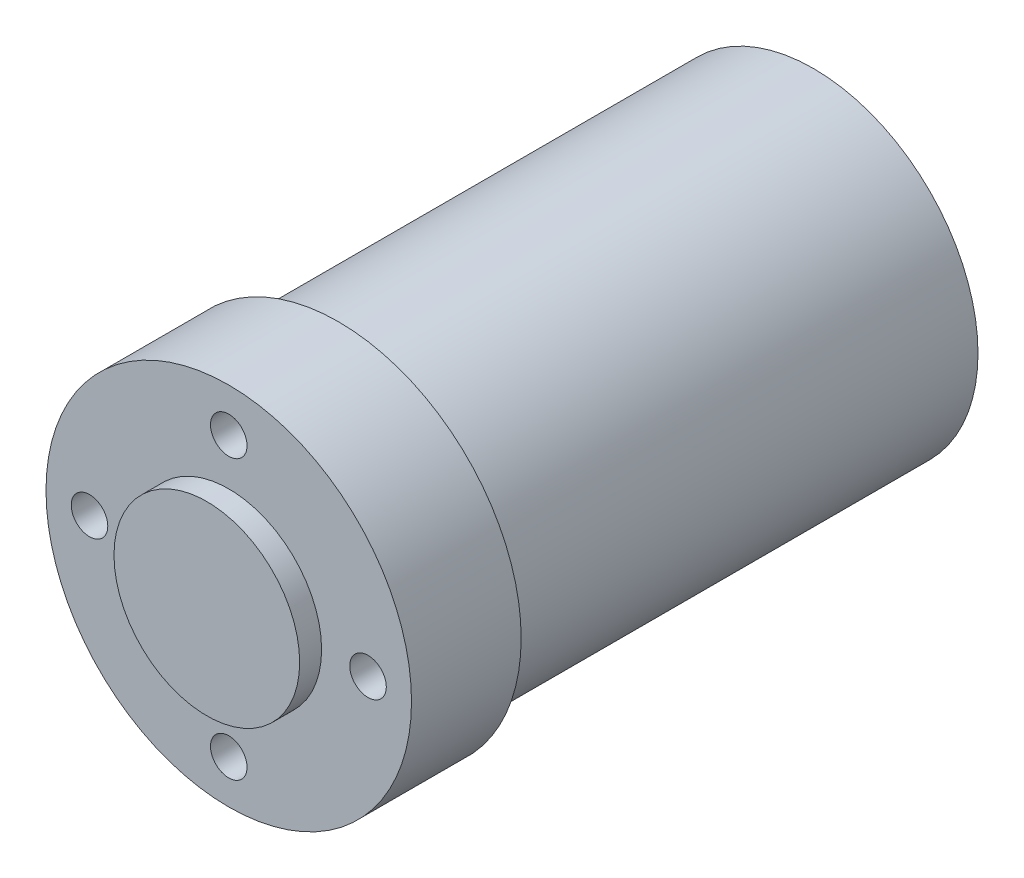
ISO-10303-21;
HEADER;
FILE_DESCRIPTION(('STEP AP214'),'2;1');
FILE_NAME('part.step','',(''),(''),'','','');
FILE_SCHEMA(('AUTOMOTIVE_DESIGN { 1 0 10303 214 1 1 1 1 }'));
ENDSEC;
DATA;
#1=APPLICATION_CONTEXT('core data for automotive mechanical design processes');
#2=APPLICATION_PROTOCOL_DEFINITION('international standard','automotive_design',2000,#1);
#3=PRODUCT_CONTEXT('',#1,'mechanical');
#4=PRODUCT('Part','Part','',(#3));
#5=PRODUCT_RELATED_PRODUCT_CATEGORY('part','',(#4));
#6=PRODUCT_DEFINITION_FORMATION('','',#4);
#7=PRODUCT_DEFINITION_CONTEXT('part definition',#1,'design');
#8=PRODUCT_DEFINITION('design','',#6,#7);
#9=PRODUCT_DEFINITION_SHAPE('','',#8);
#10=(LENGTH_UNIT() NAMED_UNIT(*) SI_UNIT(.MILLI.,.METRE.));
#11=(NAMED_UNIT(*) PLANE_ANGLE_UNIT() SI_UNIT($,.RADIAN.));
#12=(NAMED_UNIT(*) SI_UNIT($,.STERADIAN.) SOLID_ANGLE_UNIT());
#13=UNCERTAINTY_MEASURE_WITH_UNIT(LENGTH_MEASURE(1.E-05),#10,'distance_accuracy_value','');
#14=(GEOMETRIC_REPRESENTATION_CONTEXT(3) GLOBAL_UNCERTAINTY_ASSIGNED_CONTEXT((#13)) GLOBAL_UNIT_ASSIGNED_CONTEXT((#10,
#11,#12)) REPRESENTATION_CONTEXT('',''));
#15=CARTESIAN_POINT('',(0.,0.,0.));
#16=DIRECTION('',(0.,0.,1.));
#17=DIRECTION('',(1.,0.,0.));
#18=AXIS2_PLACEMENT_3D('',#15,#16,#17);
#19=CARTESIAN_POINT('',(0.,0.,80.));
#20=DIRECTION('',(0.,0.,-1.));
#21=DIRECTION('',(-1.,0.,0.));
#22=AXIS2_PLACEMENT_3D('',#19,#20,#21);
#23=CYLINDRICAL_SURFACE('',#22,25.);
#24=CARTESIAN_POINT('',(0.,0.,80.));
#25=DIRECTION('',(0.,0.,-1.));
#26=DIRECTION('',(-1.,0.,0.));
#27=AXIS2_PLACEMENT_3D('',#24,#25,#26);
#28=CIRCLE('',#27,25.);
#29=CARTESIAN_POINT('',(-25.,0.,80.));
#30=VERTEX_POINT('',#29);
#31=EDGE_CURVE('E10',#30,#30,#28,.T.);
#32=ORIENTED_EDGE('',*,*,#31,.T.);
#33=EDGE_LOOP('',(#32));
#34=FACE_BOUND('',#33,.T.);
#35=CARTESIAN_POINT('',(0.,0.,65.));
#36=DIRECTION('',(0.,0.,-1.));
#37=DIRECTION('',(-1.,0.,0.));
#38=AXIS2_PLACEMENT_3D('',#35,#36,#37);
#39=CIRCLE('',#38,25.);
#40=CARTESIAN_POINT('',(-25.,0.,65.));
#41=VERTEX_POINT('',#40);
#42=EDGE_CURVE('E40',#41,#41,#39,.T.);
#43=ORIENTED_EDGE('',*,*,#42,.F.);
#44=EDGE_LOOP('',(#43));
#45=FACE_BOUND('',#44,.T.);
#46=ADVANCED_FACE('F34',(#34,#45),#23,.T.);
#47=CARTESIAN_POINT('',(25.,0.,80.));
#48=DIRECTION('',(0.,0.,1.));
#49=DIRECTION('',(1.,0.,0.));
#50=AXIS2_PLACEMENT_3D('',#47,#48,#49);
#51=PLANE('',#50);
#52=CARTESIAN_POINT('',(-19.0499999999995,-5.41433564649196E-13,80.));
#53=DIRECTION('',(0.,0.,1.));
#54=DIRECTION('',(1.,0.,0.));
#55=AXIS2_PLACEMENT_3D('',#52,#53,#54);
#56=CIRCLE('',#55,2.50000000000086);
#57=CARTESIAN_POINT('',(-16.5499999999986,-5.41433564649196E-13,80.));
#58=VERTEX_POINT('',#57);
#59=EDGE_CURVE('E128',#58,#58,#56,.T.);
#60=ORIENTED_EDGE('',*,*,#59,.F.);
#61=EDGE_LOOP('',(#60));
#62=FACE_BOUND('',#61,.T.);
#63=CARTESIAN_POINT('',(1.07820122499364E-12,-19.05,80.));
#64=DIRECTION('',(0.,0.,1.));
#65=DIRECTION('',(1.,0.,0.));
#66=AXIS2_PLACEMENT_3D('',#63,#64,#65);
#67=CIRCLE('',#66,2.50000000000086);
#68=CARTESIAN_POINT('',(2.50000000000193,-19.05,80.));
#69=VERTEX_POINT('',#68);
#70=EDGE_CURVE('E122',#69,#69,#67,.T.);
#71=ORIENTED_EDGE('',*,*,#70,.F.);
#72=EDGE_LOOP('',(#71));
#73=FACE_BOUND('',#72,.T.);
#74=CARTESIAN_POINT('',(19.0500000000005,5.39100612496821E-13,80.));
#75=DIRECTION('',(0.,0.,1.));
#76=DIRECTION('',(1.,0.,0.));
#77=AXIS2_PLACEMENT_3D('',#74,#75,#76);
#78=CIRCLE('',#77,2.50000000000086);
#79=CARTESIAN_POINT('',(21.5500000000014,5.39100612496821E-13,80.));
#80=VERTEX_POINT('',#79);
#81=EDGE_CURVE('E116',#80,#80,#78,.T.);
#82=ORIENTED_EDGE('',*,*,#81,.F.);
#83=EDGE_LOOP('',(#82));
#84=FACE_BOUND('',#83,.T.);
#85=CARTESIAN_POINT('',(0.,19.05,80.));
#86=DIRECTION('',(0.,0.,1.));
#87=DIRECTION('',(1.,0.,0.));
#88=AXIS2_PLACEMENT_3D('',#85,#86,#87);
#89=CIRCLE('',#88,2.50000000000086);
#90=CARTESIAN_POINT('',(2.50000000000086,19.05,80.));
#91=VERTEX_POINT('',#90);
#92=EDGE_CURVE('E110',#91,#91,#89,.T.);
#93=ORIENTED_EDGE('',*,*,#92,.F.);
#94=EDGE_LOOP('',(#93));
#95=FACE_BOUND('',#94,.T.);
#96=CARTESIAN_POINT('',(0.,0.,80.));
#97=DIRECTION('',(0.,0.,1.));
#98=DIRECTION('',(1.,0.,0.));
#99=AXIS2_PLACEMENT_3D('',#96,#97,#98);
#100=CIRCLE('',#99,12.7);
#101=CARTESIAN_POINT('',(12.7,0.,80.));
#102=VERTEX_POINT('',#101);
#103=EDGE_CURVE('E48',#102,#102,#100,.T.);
#104=ORIENTED_EDGE('',*,*,#103,.F.);
#105=EDGE_LOOP('',(#104));
#106=FACE_BOUND('',#105,.T.);
#107=ORIENTED_EDGE('',*,*,#31,.F.);
#108=EDGE_LOOP('',(#107));
#109=FACE_BOUND('',#108,.T.);
#110=ADVANCED_FACE('F134',(#62,#73,#84,#95,#106,#109),#51,.T.);
#111=CARTESIAN_POINT('',(0.,0.,65.));
#112=DIRECTION('',(0.,0.,-1.));
#113=DIRECTION('',(-1.,0.,0.));
#114=AXIS2_PLACEMENT_3D('',#111,#112,#113);
#115=PLANE('',#114);
#116=CARTESIAN_POINT('',(0.,0.,65.));
#117=DIRECTION('',(0.,0.,-1.));
#118=DIRECTION('',(-1.,0.,0.));
#119=AXIS2_PLACEMENT_3D('',#116,#117,#118);
#120=CIRCLE('',#119,22.4917);
#121=CARTESIAN_POINT('',(-22.4917,0.,65.));
#122=VERTEX_POINT('',#121);
#123=EDGE_CURVE('E54',#122,#122,#120,.T.);
#124=ORIENTED_EDGE('',*,*,#123,.F.);
#125=EDGE_LOOP('',(#124));
#126=FACE_BOUND('',#125,.T.);
#127=ORIENTED_EDGE('',*,*,#42,.T.);
#128=EDGE_LOOP('',(#127));
#129=FACE_BOUND('',#128,.T.);
#130=ADVANCED_FACE('F137',(#126,#129),#115,.T.);
#131=CARTESIAN_POINT('',(0.,0.,83.));
#132=DIRECTION('',(0.,0.,-1.));
#133=DIRECTION('',(-1.,0.,0.));
#134=AXIS2_PLACEMENT_3D('',#131,#132,#133);
#135=CYLINDRICAL_SURFACE('',#134,12.7);
#136=CARTESIAN_POINT('',(0.,0.,83.));
#137=DIRECTION('',(0.,0.,1.));
#138=DIRECTION('',(1.,0.,0.));
#139=AXIS2_PLACEMENT_3D('',#136,#137,#138);
#140=CIRCLE('',#139,12.7);
#141=CARTESIAN_POINT('',(12.7,0.,83.));
#142=VERTEX_POINT('',#141);
#143=EDGE_CURVE('E44',#142,#142,#140,.T.);
#144=ORIENTED_EDGE('',*,*,#143,.F.);
#145=EDGE_LOOP('',(#144));
#146=FACE_BOUND('',#145,.T.);
#147=ORIENTED_EDGE('',*,*,#103,.T.);
#148=EDGE_LOOP('',(#147));
#149=FACE_BOUND('',#148,.T.);
#150=ADVANCED_FACE('F147',(#146,#149),#135,.T.);
#151=CARTESIAN_POINT('',(0.,0.,83.));
#152=DIRECTION('',(0.,0.,1.));
#153=DIRECTION('',(1.,0.,0.));
#154=AXIS2_PLACEMENT_3D('',#151,#152,#153);
#155=PLANE('',#154);
#156=ORIENTED_EDGE('',*,*,#143,.T.);
#157=EDGE_LOOP('',(#156));
#158=FACE_BOUND('',#157,.T.);
#159=ADVANCED_FACE('F149',(#158),#155,.T.);
#160=CARTESIAN_POINT('',(0.,0.,0.));
#161=DIRECTION('',(0.,0.,1.));
#162=DIRECTION('',(1.,0.,0.));
#163=AXIS2_PLACEMENT_3D('',#160,#161,#162);
#164=CYLINDRICAL_SURFACE('',#163,22.4917);
#165=CARTESIAN_POINT('',(0.,0.,0.));
#166=DIRECTION('',(0.,0.,-1.));
#167=DIRECTION('',(-1.,0.,0.));
#168=AXIS2_PLACEMENT_3D('',#165,#166,#167);
#169=CIRCLE('',#168,22.4917);
#170=CARTESIAN_POINT('',(-22.4917,0.,0.));
#171=VERTEX_POINT('',#170);
#172=EDGE_CURVE('E52',#171,#171,#169,.T.);
#173=ORIENTED_EDGE('',*,*,#172,.F.);
#174=EDGE_LOOP('',(#173));
#175=FACE_BOUND('',#174,.T.);
#176=ORIENTED_EDGE('',*,*,#123,.T.);
#177=EDGE_LOOP('',(#176));
#178=FACE_BOUND('',#177,.T.);
#179=ADVANCED_FACE('F156',(#175,#178),#164,.T.);
#180=CARTESIAN_POINT('',(0.,0.,0.));
#181=DIRECTION('',(0.,0.,-1.));
#182=DIRECTION('',(-1.,0.,0.));
#183=AXIS2_PLACEMENT_3D('',#180,#181,#182);
#184=PLANE('',#183);
#185=CARTESIAN_POINT('',(12.3743686707641,12.3743686707635,0.));
#186=DIRECTION('',(0.,0.,-1.));
#187=DIRECTION('',(-1.,0.,0.));
#188=AXIS2_PLACEMENT_3D('',#185,#186,#187);
#189=CIRCLE('',#188,2.49999999999999);
#190=CARTESIAN_POINT('',(9.87436867076416,12.3743686707635,0.));
#191=VERTEX_POINT('',#190);
#192=EDGE_CURVE('E104',#191,#191,#189,.T.);
#193=ORIENTED_EDGE('',*,*,#192,.F.);
#194=EDGE_LOOP('',(#193));
#195=FACE_BOUND('',#194,.T.);
#196=CARTESIAN_POINT('',(17.4999999999985,-1.49213974509621E-12,0.));
#197=DIRECTION('',(0.,0.,-1.));
#198=DIRECTION('',(-1.,0.,0.));
#199=AXIS2_PLACEMENT_3D('',#196,#197,#198);
#200=CIRCLE('',#199,2.49999999999999);
#201=CARTESIAN_POINT('',(14.9999999999985,-1.49213974509621E-12,0.));
#202=VERTEX_POINT('',#201);
#203=EDGE_CURVE('E98',#202,#202,#200,.T.);
#204=ORIENTED_EDGE('',*,*,#203,.F.);
#205=EDGE_LOOP('',(#204));
#206=FACE_BOUND('',#205,.T.);
#207=CARTESIAN_POINT('',(12.374368670762,-12.3743686707656,0.));
#208=DIRECTION('',(0.,0.,-1.));
#209=DIRECTION('',(-1.,0.,0.));
#210=AXIS2_PLACEMENT_3D('',#207,#208,#209);
#211=CIRCLE('',#210,2.49999999999999);
#212=CARTESIAN_POINT('',(9.87436867076205,-12.3743686707656,0.));
#213=VERTEX_POINT('',#212);
#214=EDGE_CURVE('E92',#213,#213,#211,.T.);
#215=ORIENTED_EDGE('',*,*,#214,.F.);
#216=EDGE_LOOP('',(#215));
#217=FACE_BOUND('',#216,.T.);
#218=CARTESIAN_POINT('',(-2.97999322639541E-12,-17.5,0.));
#219=DIRECTION('',(0.,0.,-1.));
#220=DIRECTION('',(-1.,0.,0.));
#221=AXIS2_PLACEMENT_3D('',#218,#219,#220);
#222=CIRCLE('',#221,2.49999999999999);
#223=CARTESIAN_POINT('',(-2.50000000000297,-17.5,0.));
#224=VERTEX_POINT('',#223);
#225=EDGE_CURVE('E86',#224,#224,#222,.T.);
#226=ORIENTED_EDGE('',*,*,#225,.F.);
#227=EDGE_LOOP('',(#226));
#228=FACE_BOUND('',#227,.T.);
#229=CARTESIAN_POINT('',(-12.3743686707671,-12.3743686707635,0.));
#230=DIRECTION('',(0.,0.,-1.));
#231=DIRECTION('',(-1.,0.,0.));
#232=AXIS2_PLACEMENT_3D('',#229,#230,#231);
#233=CIRCLE('',#232,2.49999999999999);
#234=CARTESIAN_POINT('',(-14.8743686707671,-12.3743686707635,0.));
#235=VERTEX_POINT('',#234);
#236=EDGE_CURVE('E80',#235,#235,#233,.T.);
#237=ORIENTED_EDGE('',*,*,#236,.F.);
#238=EDGE_LOOP('',(#237));
#239=FACE_BOUND('',#238,.T.);
#240=CARTESIAN_POINT('',(-17.5000000000015,1.4899966131977E-12,0.));
#241=DIRECTION('',(0.,0.,-1.));
#242=DIRECTION('',(-1.,0.,0.));
#243=AXIS2_PLACEMENT_3D('',#240,#241,#242);
#244=CIRCLE('',#243,2.49999999999999);
#245=CARTESIAN_POINT('',(-20.0000000000015,1.4899966131977E-12,0.));
#246=VERTEX_POINT('',#245);
#247=EDGE_CURVE('E74',#246,#246,#244,.T.);
#248=ORIENTED_EDGE('',*,*,#247,.F.);
#249=EDGE_LOOP('',(#248));
#250=FACE_BOUND('',#249,.T.);
#251=CARTESIAN_POINT('',(-12.374368670765,12.3743686707656,0.));
#252=DIRECTION('',(0.,0.,-1.));
#253=DIRECTION('',(-1.,0.,0.));
#254=AXIS2_PLACEMENT_3D('',#251,#252,#253);
#255=CIRCLE('',#254,2.49999999999999);
#256=CARTESIAN_POINT('',(-14.874368670765,12.3743686707656,0.));
#257=VERTEX_POINT('',#256);
#258=EDGE_CURVE('E68',#257,#257,#255,.T.);
#259=ORIENTED_EDGE('',*,*,#258,.F.);
#260=EDGE_LOOP('',(#259));
#261=FACE_BOUND('',#260,.T.);
#262=CARTESIAN_POINT('',(0.,17.5,0.));
#263=DIRECTION('',(0.,0.,-1.));
#264=DIRECTION('',(-1.,0.,0.));
#265=AXIS2_PLACEMENT_3D('',#262,#263,#264);
#266=CIRCLE('',#265,2.49999999999999);
#267=CARTESIAN_POINT('',(-2.49999999999999,17.5,0.));
#268=VERTEX_POINT('',#267);
#269=EDGE_CURVE('E62',#268,#268,#266,.T.);
#270=ORIENTED_EDGE('',*,*,#269,.F.);
#271=EDGE_LOOP('',(#270));
#272=FACE_BOUND('',#271,.T.);
#273=ORIENTED_EDGE('',*,*,#172,.T.);
#274=EDGE_LOOP('',(#273));
#275=FACE_BOUND('',#274,.T.);
#276=ADVANCED_FACE('F189',(#195,#206,#217,#228,#239,#250,#261,#272,#275),#184,.T.);
#277=CARTESIAN_POINT('',(0.,17.5,7.99999999999999));
#278=DIRECTION('',(0.,0.,1.));
#279=DIRECTION('',(1.,0.,0.));
#280=AXIS2_PLACEMENT_3D('',#277,#278,#279);
#281=PLANE('',#280);
#282=CARTESIAN_POINT('',(0.,17.5,7.99999999999999));
#283=DIRECTION('',(0.,0.,-1.));
#284=DIRECTION('',(-1.,0.,0.));
#285=AXIS2_PLACEMENT_3D('',#282,#283,#284);
#286=CIRCLE('',#285,2.49999999999999);
#287=CARTESIAN_POINT('',(-2.49999999999999,17.5,7.99999999999999));
#288=VERTEX_POINT('',#287);
#289=EDGE_CURVE('E57',#288,#288,#286,.T.);
#290=ORIENTED_EDGE('',*,*,#289,.T.);
#291=EDGE_LOOP('',(#290));
#292=FACE_BOUND('',#291,.T.);
#293=ADVANCED_FACE('F199',(#292),#281,.F.);
#294=CARTESIAN_POINT('',(0.,17.5,0.));
#295=DIRECTION('',(0.,0.,-1.));
#296=DIRECTION('',(-1.,0.,0.));
#297=AXIS2_PLACEMENT_3D('',#294,#295,#296);
#298=CYLINDRICAL_SURFACE('',#297,2.49999999999999);
#299=ORIENTED_EDGE('',*,*,#289,.F.);
#300=EDGE_LOOP('',(#299));
#301=FACE_BOUND('',#300,.T.);
#302=ORIENTED_EDGE('',*,*,#269,.T.);
#303=EDGE_LOOP('',(#302));
#304=FACE_BOUND('',#303,.T.);
#305=ADVANCED_FACE('F209',(#301,#304),#298,.F.);
#306=CARTESIAN_POINT('',(-12.374368670765,12.3743686707656,7.99999999999999));
#307=DIRECTION('',(0.,0.,1.));
#308=DIRECTION('',(1.,0.,0.));
#309=AXIS2_PLACEMENT_3D('',#306,#307,#308);
#310=PLANE('',#309);
#311=CARTESIAN_POINT('',(-12.374368670765,12.3743686707656,7.99999999999999));
#312=DIRECTION('',(0.,0.,-1.));
#313=DIRECTION('',(-1.,0.,0.));
#314=AXIS2_PLACEMENT_3D('',#311,#312,#313);
#315=CIRCLE('',#314,2.49999999999999);
#316=CARTESIAN_POINT('',(-14.874368670765,12.3743686707656,7.99999999999999));
#317=VERTEX_POINT('',#316);
#318=EDGE_CURVE('E65',#317,#317,#315,.T.);
#319=ORIENTED_EDGE('',*,*,#318,.T.);
#320=EDGE_LOOP('',(#319));
#321=FACE_BOUND('',#320,.T.);
#322=ADVANCED_FACE('F219',(#321),#310,.F.);
#323=CARTESIAN_POINT('',(-12.374368670765,12.3743686707656,0.));
#324=DIRECTION('',(0.,0.,-1.));
#325=DIRECTION('',(-1.,0.,0.));
#326=AXIS2_PLACEMENT_3D('',#323,#324,#325);
#327=CYLINDRICAL_SURFACE('',#326,2.49999999999999);
#328=ORIENTED_EDGE('',*,*,#318,.F.);
#329=EDGE_LOOP('',(#328));
#330=FACE_BOUND('',#329,.T.);
#331=ORIENTED_EDGE('',*,*,#258,.T.);
#332=EDGE_LOOP('',(#331));
#333=FACE_BOUND('',#332,.T.);
#334=ADVANCED_FACE('F229',(#330,#333),#327,.F.);
#335=CARTESIAN_POINT('',(-17.5000000000015,1.4899966131977E-12,7.99999999999999));
#336=DIRECTION('',(0.,0.,1.));
#337=DIRECTION('',(1.,0.,0.));
#338=AXIS2_PLACEMENT_3D('',#335,#336,#337);
#339=PLANE('',#338);
#340=CARTESIAN_POINT('',(-17.5000000000015,1.4899966131977E-12,7.99999999999999));
#341=DIRECTION('',(0.,0.,-1.));
#342=DIRECTION('',(-1.,0.,0.));
#343=AXIS2_PLACEMENT_3D('',#340,#341,#342);
#344=CIRCLE('',#343,2.49999999999999);
#345=CARTESIAN_POINT('',(-20.0000000000015,1.4899966131977E-12,7.99999999999999));
#346=VERTEX_POINT('',#345);
#347=EDGE_CURVE('E71',#346,#346,#344,.T.);
#348=ORIENTED_EDGE('',*,*,#347,.T.);
#349=EDGE_LOOP('',(#348));
#350=FACE_BOUND('',#349,.T.);
#351=ADVANCED_FACE('F239',(#350),#339,.F.);
#352=CARTESIAN_POINT('',(-17.5000000000015,1.4899966131977E-12,0.));
#353=DIRECTION('',(0.,0.,-1.));
#354=DIRECTION('',(-1.,0.,0.));
#355=AXIS2_PLACEMENT_3D('',#352,#353,#354);
#356=CYLINDRICAL_SURFACE('',#355,2.49999999999999);
#357=ORIENTED_EDGE('',*,*,#347,.F.);
#358=EDGE_LOOP('',(#357));
#359=FACE_BOUND('',#358,.T.);
#360=ORIENTED_EDGE('',*,*,#247,.T.);
#361=EDGE_LOOP('',(#360));
#362=FACE_BOUND('',#361,.T.);
#363=ADVANCED_FACE('F249',(#359,#362),#356,.F.);
#364=CARTESIAN_POINT('',(-12.3743686707671,-12.3743686707635,7.99999999999999));
#365=DIRECTION('',(0.,0.,1.));
#366=DIRECTION('',(1.,0.,0.));
#367=AXIS2_PLACEMENT_3D('',#364,#365,#366);
#368=PLANE('',#367);
#369=CARTESIAN_POINT('',(-12.3743686707671,-12.3743686707635,7.99999999999999));
#370=DIRECTION('',(0.,0.,-1.));
#371=DIRECTION('',(-1.,0.,0.));
#372=AXIS2_PLACEMENT_3D('',#369,#370,#371);
#373=CIRCLE('',#372,2.49999999999999);
#374=CARTESIAN_POINT('',(-14.8743686707671,-12.3743686707635,7.99999999999999));
#375=VERTEX_POINT('',#374);
#376=EDGE_CURVE('E77',#375,#375,#373,.T.);
#377=ORIENTED_EDGE('',*,*,#376,.T.);
#378=EDGE_LOOP('',(#377));
#379=FACE_BOUND('',#378,.T.);
#380=ADVANCED_FACE('F259',(#379),#368,.F.);
#381=CARTESIAN_POINT('',(-12.3743686707671,-12.3743686707635,0.));
#382=DIRECTION('',(0.,0.,-1.));
#383=DIRECTION('',(-1.,0.,0.));
#384=AXIS2_PLACEMENT_3D('',#381,#382,#383);
#385=CYLINDRICAL_SURFACE('',#384,2.49999999999999);
#386=ORIENTED_EDGE('',*,*,#376,.F.);
#387=EDGE_LOOP('',(#386));
#388=FACE_BOUND('',#387,.T.);
#389=ORIENTED_EDGE('',*,*,#236,.T.);
#390=EDGE_LOOP('',(#389));
#391=FACE_BOUND('',#390,.T.);
#392=ADVANCED_FACE('F269',(#388,#391),#385,.F.);
#393=CARTESIAN_POINT('',(-2.98195266127404E-12,-17.5,7.99999999999999));
#394=DIRECTION('',(0.,0.,1.));
#395=DIRECTION('',(1.,0.,0.));
#396=AXIS2_PLACEMENT_3D('',#393,#394,#395);
#397=PLANE('',#396);
#398=CARTESIAN_POINT('',(-2.97999322639541E-12,-17.5,7.99999999999999));
#399=DIRECTION('',(0.,0.,-1.));
#400=DIRECTION('',(-1.,0.,0.));
#401=AXIS2_PLACEMENT_3D('',#398,#399,#400);
#402=CIRCLE('',#401,2.49999999999999);
#403=CARTESIAN_POINT('',(-2.50000000000297,-17.5,7.99999999999999));
#404=VERTEX_POINT('',#403);
#405=EDGE_CURVE('E83',#404,#404,#402,.T.);
#406=ORIENTED_EDGE('',*,*,#405,.T.);
#407=EDGE_LOOP('',(#406));
#408=FACE_BOUND('',#407,.T.);
#409=ADVANCED_FACE('F279',(#408),#397,.F.);
#410=CARTESIAN_POINT('',(-2.97999322639541E-12,-17.5,0.));
#411=DIRECTION('',(0.,0.,-1.));
#412=DIRECTION('',(-1.,0.,0.));
#413=AXIS2_PLACEMENT_3D('',#410,#411,#412);
#414=CYLINDRICAL_SURFACE('',#413,2.49999999999999);
#415=ORIENTED_EDGE('',*,*,#405,.F.);
#416=EDGE_LOOP('',(#415));
#417=FACE_BOUND('',#416,.T.);
#418=ORIENTED_EDGE('',*,*,#225,.T.);
#419=EDGE_LOOP('',(#418));
#420=FACE_BOUND('',#419,.T.);
#421=ADVANCED_FACE('F289',(#417,#420),#414,.F.);
#422=CARTESIAN_POINT('',(12.374368670762,-12.3743686707656,7.99999999999999));
#423=DIRECTION('',(0.,0.,1.));
#424=DIRECTION('',(1.,0.,0.));
#425=AXIS2_PLACEMENT_3D('',#422,#423,#424);
#426=PLANE('',#425);
#427=CARTESIAN_POINT('',(12.374368670762,-12.3743686707656,7.99999999999999));
#428=DIRECTION('',(0.,0.,-1.));
#429=DIRECTION('',(-1.,0.,0.));
#430=AXIS2_PLACEMENT_3D('',#427,#428,#429);
#431=CIRCLE('',#430,2.49999999999999);
#432=CARTESIAN_POINT('',(9.87436867076205,-12.3743686707656,7.99999999999999));
#433=VERTEX_POINT('',#432);
#434=EDGE_CURVE('E89',#433,#433,#431,.T.);
#435=ORIENTED_EDGE('',*,*,#434,.T.);
#436=EDGE_LOOP('',(#435));
#437=FACE_BOUND('',#436,.T.);
#438=ADVANCED_FACE('F299',(#437),#426,.F.);
#439=CARTESIAN_POINT('',(12.374368670762,-12.3743686707656,0.));
#440=DIRECTION('',(0.,0.,-1.));
#441=DIRECTION('',(-1.,0.,0.));
#442=AXIS2_PLACEMENT_3D('',#439,#440,#441);
#443=CYLINDRICAL_SURFACE('',#442,2.49999999999999);
#444=ORIENTED_EDGE('',*,*,#434,.F.);
#445=EDGE_LOOP('',(#444));
#446=FACE_BOUND('',#445,.T.);
#447=ORIENTED_EDGE('',*,*,#214,.T.);
#448=EDGE_LOOP('',(#447));
#449=FACE_BOUND('',#448,.T.);
#450=ADVANCED_FACE('F309',(#446,#449),#443,.F.);
#451=CARTESIAN_POINT('',(17.4999999999985,-1.49213974509621E-12,7.99999999999999));
#452=DIRECTION('',(0.,0.,1.));
#453=DIRECTION('',(1.,0.,0.));
#454=AXIS2_PLACEMENT_3D('',#451,#452,#453);
#455=PLANE('',#454);
#456=CARTESIAN_POINT('',(17.4999999999985,-1.49213974509621E-12,7.99999999999999));
#457=DIRECTION('',(0.,0.,-1.));
#458=DIRECTION('',(-1.,0.,0.));
#459=AXIS2_PLACEMENT_3D('',#456,#457,#458);
#460=CIRCLE('',#459,2.49999999999999);
#461=CARTESIAN_POINT('',(14.9999999999985,-1.49213974509621E-12,7.99999999999999));
#462=VERTEX_POINT('',#461);
#463=EDGE_CURVE('E95',#462,#462,#460,.T.);
#464=ORIENTED_EDGE('',*,*,#463,.T.);
#465=EDGE_LOOP('',(#464));
#466=FACE_BOUND('',#465,.T.);
#467=ADVANCED_FACE('F319',(#466),#455,.F.);
#468=CARTESIAN_POINT('',(17.4999999999985,-1.49213974509621E-12,0.));
#469=DIRECTION('',(0.,0.,-1.));
#470=DIRECTION('',(-1.,0.,0.));
#471=AXIS2_PLACEMENT_3D('',#468,#469,#470);
#472=CYLINDRICAL_SURFACE('',#471,2.49999999999999);
#473=ORIENTED_EDGE('',*,*,#463,.F.);
#474=EDGE_LOOP('',(#473));
#475=FACE_BOUND('',#474,.T.);
#476=ORIENTED_EDGE('',*,*,#203,.T.);
#477=EDGE_LOOP('',(#476));
#478=FACE_BOUND('',#477,.T.);
#479=ADVANCED_FACE('F329',(#475,#478),#472,.F.);
#480=CARTESIAN_POINT('',(12.3743686707641,12.3743686707635,7.99999999999999));
#481=DIRECTION('',(0.,0.,1.));
#482=DIRECTION('',(1.,0.,0.));
#483=AXIS2_PLACEMENT_3D('',#480,#481,#482);
#484=PLANE('',#483);
#485=CARTESIAN_POINT('',(12.3743686707641,12.3743686707635,7.99999999999999));
#486=DIRECTION('',(0.,0.,-1.));
#487=DIRECTION('',(-1.,0.,0.));
#488=AXIS2_PLACEMENT_3D('',#485,#486,#487);
#489=CIRCLE('',#488,2.49999999999999);
#490=CARTESIAN_POINT('',(9.87436867076416,12.3743686707635,7.99999999999999));
#491=VERTEX_POINT('',#490);
#492=EDGE_CURVE('E101',#491,#491,#489,.T.);
#493=ORIENTED_EDGE('',*,*,#492,.T.);
#494=EDGE_LOOP('',(#493));
#495=FACE_BOUND('',#494,.T.);
#496=ADVANCED_FACE('F339',(#495),#484,.F.);
#497=CARTESIAN_POINT('',(12.3743686707641,12.3743686707635,0.));
#498=DIRECTION('',(0.,0.,-1.));
#499=DIRECTION('',(-1.,0.,0.));
#500=AXIS2_PLACEMENT_3D('',#497,#498,#499);
#501=CYLINDRICAL_SURFACE('',#500,2.49999999999999);
#502=ORIENTED_EDGE('',*,*,#492,.F.);
#503=EDGE_LOOP('',(#502));
#504=FACE_BOUND('',#503,.T.);
#505=ORIENTED_EDGE('',*,*,#192,.T.);
#506=EDGE_LOOP('',(#505));
#507=FACE_BOUND('',#506,.T.);
#508=ADVANCED_FACE('F348',(#504,#507),#501,.F.);
#509=CARTESIAN_POINT('',(0.,19.05,67.554));
#510=DIRECTION('',(0.,0.,-1.));
#511=DIRECTION('',(-1.,0.,0.));
#512=AXIS2_PLACEMENT_3D('',#509,#510,#511);
#513=PLANE('',#512);
#514=CARTESIAN_POINT('',(0.,19.05,67.554));
#515=DIRECTION('',(0.,0.,1.));
#516=DIRECTION('',(1.,0.,0.));
#517=AXIS2_PLACEMENT_3D('',#514,#515,#516);
#518=CIRCLE('',#517,2.50000000000085);
#519=CARTESIAN_POINT('',(2.50000000000085,19.05,67.554));
#520=VERTEX_POINT('',#519);
#521=EDGE_CURVE('E107',#520,#520,#518,.T.);
#522=ORIENTED_EDGE('',*,*,#521,.T.);
#523=EDGE_LOOP('',(#522));
#524=FACE_BOUND('',#523,.T.);
#525=ADVANCED_FACE('F357',(#524),#513,.F.);
#526=CARTESIAN_POINT('',(0.,19.05,80.));
#527=DIRECTION('',(0.,0.,1.));
#528=DIRECTION('',(1.,0.,0.));
#529=AXIS2_PLACEMENT_3D('',#526,#527,#528);
#530=CYLINDRICAL_SURFACE('',#529,2.50000000000085);
#531=ORIENTED_EDGE('',*,*,#521,.F.);
#532=EDGE_LOOP('',(#531));
#533=FACE_BOUND('',#532,.T.);
#534=ORIENTED_EDGE('',*,*,#92,.T.);
#535=EDGE_LOOP('',(#534));
#536=FACE_BOUND('',#535,.T.);
#537=ADVANCED_FACE('F367',(#533,#536),#530,.F.);
#538=CARTESIAN_POINT('',(19.0500000000005,5.39100612496821E-13,67.554));
#539=DIRECTION('',(0.,0.,-1.));
#540=DIRECTION('',(-1.,0.,0.));
#541=AXIS2_PLACEMENT_3D('',#538,#539,#540);
#542=PLANE('',#541);
#543=CARTESIAN_POINT('',(19.0500000000005,5.39100612496821E-13,67.554));
#544=DIRECTION('',(0.,0.,1.));
#545=DIRECTION('',(1.,0.,0.));
#546=AXIS2_PLACEMENT_3D('',#543,#544,#545);
#547=CIRCLE('',#546,2.50000000000086);
#548=CARTESIAN_POINT('',(21.5500000000014,5.39100612496821E-13,67.554));
#549=VERTEX_POINT('',#548);
#550=EDGE_CURVE('E113',#549,#549,#547,.T.);
#551=ORIENTED_EDGE('',*,*,#550,.T.);
#552=EDGE_LOOP('',(#551));
#553=FACE_BOUND('',#552,.T.);
#554=ADVANCED_FACE('F374',(#553),#542,.F.);
#555=CARTESIAN_POINT('',(19.0500000000005,5.39100612496821E-13,80.));
#556=DIRECTION('',(0.,0.,1.));
#557=DIRECTION('',(1.,0.,0.));
#558=AXIS2_PLACEMENT_3D('',#555,#556,#557);
#559=CYLINDRICAL_SURFACE('',#558,2.50000000000086);
#560=ORIENTED_EDGE('',*,*,#550,.F.);
#561=EDGE_LOOP('',(#560));
#562=FACE_BOUND('',#561,.T.);
#563=ORIENTED_EDGE('',*,*,#81,.T.);
#564=EDGE_LOOP('',(#563));
#565=FACE_BOUND('',#564,.T.);
#566=ADVANCED_FACE('F382',(#562,#565),#559,.F.);
#567=CARTESIAN_POINT('',(1.0751528341812E-12,-19.05,67.554));
#568=DIRECTION('',(0.,0.,-1.));
#569=DIRECTION('',(-1.,0.,0.));
#570=AXIS2_PLACEMENT_3D('',#567,#568,#569);
#571=PLANE('',#570);
#572=CARTESIAN_POINT('',(1.07820122499364E-12,-19.05,67.554));
#573=DIRECTION('',(0.,0.,1.));
#574=DIRECTION('',(1.,0.,0.));
#575=AXIS2_PLACEMENT_3D('',#572,#573,#574);
#576=CIRCLE('',#575,2.50000000000085);
#577=CARTESIAN_POINT('',(2.50000000000193,-19.05,67.554));
#578=VERTEX_POINT('',#577);
#579=EDGE_CURVE('E119',#578,#578,#576,.T.);
#580=ORIENTED_EDGE('',*,*,#579,.T.);
#581=EDGE_LOOP('',(#580));
#582=FACE_BOUND('',#581,.T.);
#583=ADVANCED_FACE('F390',(#582),#571,.F.);
#584=CARTESIAN_POINT('',(1.07820122499364E-12,-19.05,80.));
#585=DIRECTION('',(0.,0.,1.));
#586=DIRECTION('',(1.,0.,0.));
#587=AXIS2_PLACEMENT_3D('',#584,#585,#586);
#588=CYLINDRICAL_SURFACE('',#587,2.50000000000085);
#589=ORIENTED_EDGE('',*,*,#579,.F.);
#590=EDGE_LOOP('',(#589));
#591=FACE_BOUND('',#590,.T.);
#592=ORIENTED_EDGE('',*,*,#70,.T.);
#593=EDGE_LOOP('',(#592));
#594=FACE_BOUND('',#593,.T.);
#595=ADVANCED_FACE('F398',(#591,#594),#588,.F.);
#596=CARTESIAN_POINT('',(-19.0499999999995,-5.41433564649196E-13,67.554));
#597=DIRECTION('',(0.,0.,-1.));
#598=DIRECTION('',(-1.,0.,0.));
#599=AXIS2_PLACEMENT_3D('',#596,#597,#598);
#600=PLANE('',#599);
#601=CARTESIAN_POINT('',(-19.0499999999995,-5.41433564649196E-13,67.554));
#602=DIRECTION('',(0.,0.,1.));
#603=DIRECTION('',(1.,0.,0.));
#604=AXIS2_PLACEMENT_3D('',#601,#602,#603);
#605=CIRCLE('',#604,2.50000000000086);
#606=CARTESIAN_POINT('',(-16.5499999999986,-5.41433564649196E-13,67.554));
#607=VERTEX_POINT('',#606);
#608=EDGE_CURVE('E125',#607,#607,#605,.T.);
#609=ORIENTED_EDGE('',*,*,#608,.T.);
#610=EDGE_LOOP('',(#609));
#611=FACE_BOUND('',#610,.T.);
#612=ADVANCED_FACE('F406',(#611),#600,.F.);
#613=CARTESIAN_POINT('',(-19.0499999999995,-5.41433564649196E-13,80.));
#614=DIRECTION('',(0.,0.,1.));
#615=DIRECTION('',(1.,0.,0.));
#616=AXIS2_PLACEMENT_3D('',#613,#614,#615);
#617=CYLINDRICAL_SURFACE('',#616,2.50000000000086);
#618=ORIENTED_EDGE('',*,*,#608,.F.);
#619=EDGE_LOOP('',(#618));
#620=FACE_BOUND('',#619,.T.);
#621=ORIENTED_EDGE('',*,*,#59,.T.);
#622=EDGE_LOOP('',(#621));
#623=FACE_BOUND('',#622,.T.);
#624=ADVANCED_FACE('F132',(#620,#623),#617,.F.);
#625=CLOSED_SHELL('',(#46,#110,#130,#150,#159,#179,#276,#293,#305,#322,#334,#351,#363,#380,#392,
#409,#421,#438,#450,#467,#479,#496,#508,#525,#537,#554,#566,#583,#595,#612,#624));
#626=MANIFOLD_SOLID_BREP('B2',#625);
#627=ADVANCED_BREP_SHAPE_REPRESENTATION('',(#18,#626),#14);
#628=SHAPE_DEFINITION_REPRESENTATION(#9,#627);
ENDSEC;
END-ISO-10303-21;
